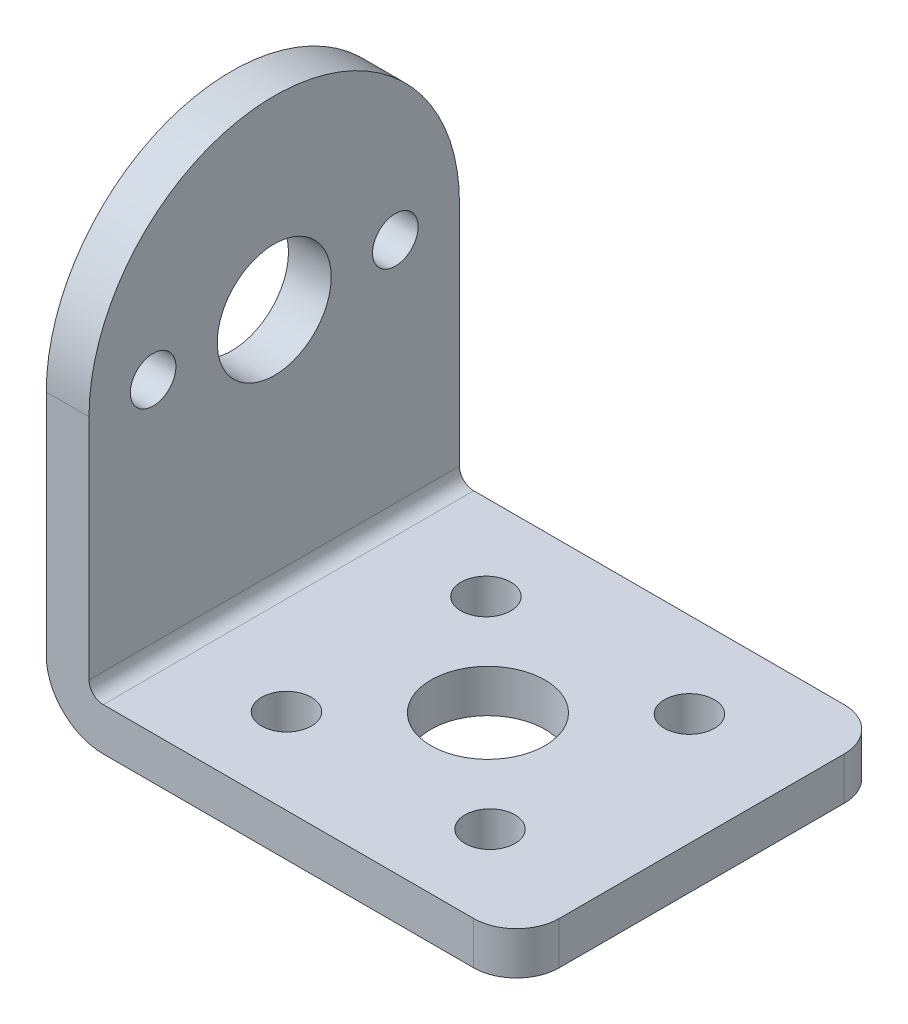
ISO-10303-21;
HEADER;
FILE_DESCRIPTION(('STEP AP214'),'2;1');
FILE_NAME('part.step','',(''),(''),'','','');
FILE_SCHEMA(('AUTOMOTIVE_DESIGN { 1 0 10303 214 1 1 1 1 }'));
ENDSEC;
DATA;
#1=APPLICATION_CONTEXT('core data for automotive mechanical design processes');
#2=APPLICATION_PROTOCOL_DEFINITION('international standard','automotive_design',2000,#1);
#3=PRODUCT_CONTEXT('',#1,'mechanical');
#4=PRODUCT('Part','Part','',(#3));
#5=PRODUCT_RELATED_PRODUCT_CATEGORY('part','',(#4));
#6=PRODUCT_DEFINITION_FORMATION('','',#4);
#7=PRODUCT_DEFINITION_CONTEXT('part definition',#1,'design');
#8=PRODUCT_DEFINITION('design','',#6,#7);
#9=PRODUCT_DEFINITION_SHAPE('','',#8);
#10=(LENGTH_UNIT() NAMED_UNIT(*) SI_UNIT(.MILLI.,.METRE.));
#11=(NAMED_UNIT(*) PLANE_ANGLE_UNIT() SI_UNIT($,.RADIAN.));
#12=(NAMED_UNIT(*) SI_UNIT($,.STERADIAN.) SOLID_ANGLE_UNIT());
#13=UNCERTAINTY_MEASURE_WITH_UNIT(LENGTH_MEASURE(1.E-05),#10,'distance_accuracy_value','');
#14=(GEOMETRIC_REPRESENTATION_CONTEXT(3) GLOBAL_UNCERTAINTY_ASSIGNED_CONTEXT((#13)) GLOBAL_UNIT_ASSIGNED_CONTEXT((#10,
#11,#12)) REPRESENTATION_CONTEXT('',''));
#15=CARTESIAN_POINT('',(0.,0.,0.));
#16=DIRECTION('',(0.,0.,1.));
#17=DIRECTION('',(1.,0.,0.));
#18=AXIS2_PLACEMENT_3D('',#15,#16,#17);
#19=CARTESIAN_POINT('',(0.,4.00000000000003,-13.));
#20=DIRECTION('',(-1.,0.,0.));
#21=DIRECTION('',(0.,0.,1.));
#22=AXIS2_PLACEMENT_3D('',#19,#20,#21);
#23=PLANE('',#22);
#24=CARTESIAN_POINT('',(0.,20.,8.5));
#25=DIRECTION('',(-1.,0.,0.));
#26=DIRECTION('',(0.,0.,1.));
#27=AXIS2_PLACEMENT_3D('',#24,#25,#26);
#28=CIRCLE('',#27,2.1);
#29=CARTESIAN_POINT('',(0.,20.,10.6));
#30=VERTEX_POINT('',#29);
#31=EDGE_CURVE('E165',#30,#30,#28,.F.);
#32=ORIENTED_EDGE('',*,*,#31,.T.);
#33=EDGE_LOOP('',(#32));
#34=FACE_BOUND('',#33,.T.);
#35=CARTESIAN_POINT('',(0.,20.,-8.5));
#36=DIRECTION('',(-1.,0.,0.));
#37=DIRECTION('',(0.,0.,1.));
#38=AXIS2_PLACEMENT_3D('',#35,#36,#37);
#39=CIRCLE('',#38,2.1);
#40=CARTESIAN_POINT('',(0.,20.,-6.4));
#41=VERTEX_POINT('',#40);
#42=EDGE_CURVE('E150',#41,#41,#39,.F.);
#43=ORIENTED_EDGE('',*,*,#42,.T.);
#44=EDGE_LOOP('',(#43));
#45=FACE_BOUND('',#44,.T.);
#46=CARTESIAN_POINT('',(0.,20.,0.));
#47=DIRECTION('',(1.,0.,0.));
#48=DIRECTION('',(0.,0.,-1.));
#49=AXIS2_PLACEMENT_3D('',#46,#47,#48);
#50=CIRCLE('',#49,4.);
#51=CARTESIAN_POINT('',(0.,20.,-4.));
#52=VERTEX_POINT('',#51);
#53=EDGE_CURVE('E231',#52,#52,#50,.T.);
#54=ORIENTED_EDGE('',*,*,#53,.T.);
#55=EDGE_LOOP('',(#54));
#56=FACE_BOUND('',#55,.T.);
#57=CARTESIAN_POINT('',(0.,20.,0.));
#58=DIRECTION('',(-1.,0.,0.));
#59=DIRECTION('',(0.,0.,-1.));
#60=AXIS2_PLACEMENT_3D('',#57,#58,#59);
#61=CIRCLE('',#60,13.);
#62=CARTESIAN_POINT('',(0.,20.,13.));
#63=VERTEX_POINT('',#62);
#64=CARTESIAN_POINT('',(0.,20.,-13.));
#65=VERTEX_POINT('',#64);
#66=EDGE_CURVE('E120',#63,#65,#61,.T.);
#67=ORIENTED_EDGE('',*,*,#66,.T.);
#68=DIRECTION('',(0.,-1.,0.));
#69=VECTOR('',#68,1.);
#70=CARTESIAN_POINT('',(0.,4.00000000000003,-13.));
#71=LINE('',#70,#69);
#72=CARTESIAN_POINT('',(0.,4.00000000000003,-13.));
#73=VERTEX_POINT('',#72);
#74=EDGE_CURVE('E131',#65,#73,#71,.T.);
#75=ORIENTED_EDGE('',*,*,#74,.T.);
#76=DIRECTION('',(0.,0.,1.));
#77=VECTOR('',#76,1.);
#78=CARTESIAN_POINT('',(0.,4.00000000000003,-13.));
#79=LINE('',#78,#77);
#80=CARTESIAN_POINT('',(0.,4.00000000000003,13.));
#81=VERTEX_POINT('',#80);
#82=EDGE_CURVE('E151',#73,#81,#79,.T.);
#83=ORIENTED_EDGE('',*,*,#82,.T.);
#84=DIRECTION('',(0.,-1.,0.));
#85=VECTOR('',#84,1.);
#86=CARTESIAN_POINT('',(0.,4.00000000000003,13.));
#87=LINE('',#86,#85);
#88=EDGE_CURVE('E133',#63,#81,#87,.T.);
#89=ORIENTED_EDGE('',*,*,#88,.F.);
#90=EDGE_LOOP('',(#67,#75,#83,#89));
#91=FACE_BOUND('',#90,.T.);
#92=ADVANCED_FACE('F36',(#34,#45,#56,#91),#23,.T.);
#93=CARTESIAN_POINT('',(3.,4.00000000000003,-13.));
#94=DIRECTION('',(-1.,0.,0.));
#95=DIRECTION('',(0.,0.,1.));
#96=AXIS2_PLACEMENT_3D('',#93,#94,#95);
#97=PLANE('',#96);
#98=CARTESIAN_POINT('',(3.,20.,-8.5));
#99=DIRECTION('',(1.,0.,0.));
#100=DIRECTION('',(0.,0.,1.));
#101=AXIS2_PLACEMENT_3D('',#98,#99,#100);
#102=CIRCLE('',#101,1.6);
#103=CARTESIAN_POINT('',(3.,20.,-6.9));
#104=VERTEX_POINT('',#103);
#105=EDGE_CURVE('E481',#104,#104,#102,.T.);
#106=ORIENTED_EDGE('',*,*,#105,.F.);
#107=EDGE_LOOP('',(#106));
#108=FACE_BOUND('',#107,.T.);
#109=CARTESIAN_POINT('',(3.,20.,8.5));
#110=DIRECTION('',(1.,0.,0.));
#111=DIRECTION('',(0.,0.,-1.));
#112=AXIS2_PLACEMENT_3D('',#109,#110,#111);
#113=CIRCLE('',#112,1.6);
#114=CARTESIAN_POINT('',(3.,20.,6.9));
#115=VERTEX_POINT('',#114);
#116=EDGE_CURVE('E477',#115,#115,#113,.T.);
#117=ORIENTED_EDGE('',*,*,#116,.F.);
#118=EDGE_LOOP('',(#117));
#119=FACE_BOUND('',#118,.T.);
#120=CARTESIAN_POINT('',(3.,20.,0.));
#121=DIRECTION('',(1.,0.,0.));
#122=DIRECTION('',(0.,0.,-1.));
#123=AXIS2_PLACEMENT_3D('',#120,#121,#122);
#124=CIRCLE('',#123,4.);
#125=CARTESIAN_POINT('',(3.,20.,-4.));
#126=VERTEX_POINT('',#125);
#127=EDGE_CURVE('E475',#126,#126,#124,.T.);
#128=ORIENTED_EDGE('',*,*,#127,.F.);
#129=EDGE_LOOP('',(#128));
#130=FACE_BOUND('',#129,.T.);
#131=DIRECTION('',(0.,1.,0.));
#132=VECTOR('',#131,1.);
#133=CARTESIAN_POINT('',(3.,4.00000000000003,-13.));
#134=LINE('',#133,#132);
#135=CARTESIAN_POINT('',(3.,20.,-13.));
#136=VERTEX_POINT('',#135);
#137=CARTESIAN_POINT('',(3.,4.00000000000001,-13.));
#138=VERTEX_POINT('',#137);
#139=EDGE_CURVE('E140',#136,#138,#134,.F.);
#140=ORIENTED_EDGE('',*,*,#139,.F.);
#141=CARTESIAN_POINT('',(3.,20.,0.));
#142=DIRECTION('',(-1.,0.,0.));
#143=DIRECTION('',(0.,0.,-1.));
#144=AXIS2_PLACEMENT_3D('',#141,#142,#143);
#145=CIRCLE('',#144,13.);
#146=CARTESIAN_POINT('',(3.,20.,13.));
#147=VERTEX_POINT('',#146);
#148=EDGE_CURVE('E122',#147,#136,#145,.T.);
#149=ORIENTED_EDGE('',*,*,#148,.F.);
#150=DIRECTION('',(0.,1.,0.));
#151=VECTOR('',#150,1.);
#152=CARTESIAN_POINT('',(3.,4.00000000000003,13.));
#153=LINE('',#152,#151);
#154=CARTESIAN_POINT('',(3.,4.00000000000001,13.));
#155=VERTEX_POINT('',#154);
#156=EDGE_CURVE('E213',#147,#155,#153,.F.);
#157=ORIENTED_EDGE('',*,*,#156,.T.);
#158=DIRECTION('',(0.,0.,1.));
#159=VECTOR('',#158,1.);
#160=CARTESIAN_POINT('',(3.,4.00000000000001,-13.));
#161=LINE('',#160,#159);
#162=EDGE_CURVE('E153',#138,#155,#161,.T.);
#163=ORIENTED_EDGE('',*,*,#162,.F.);
#164=EDGE_LOOP('',(#140,#149,#157,#163));
#165=FACE_BOUND('',#164,.T.);
#166=ADVANCED_FACE('F230',(#108,#119,#130,#165),#97,.F.);
#167=CARTESIAN_POINT('',(4.00000000000003,0.,-13.));
#168=DIRECTION('',(0.,-1.,0.));
#169=DIRECTION('',(0.,0.,-1.));
#170=AXIS2_PLACEMENT_3D('',#167,#168,#169);
#171=PLANE('',#170);
#172=CARTESIAN_POINT('',(10.8585715714571,0.,-7.));
#173=DIRECTION('',(0.,1.,0.));
#174=DIRECTION('',(0.,0.,1.));
#175=AXIS2_PLACEMENT_3D('',#172,#173,#174);
#176=CIRCLE('',#175,1.75);
#177=CARTESIAN_POINT('',(10.8585715714571,0.,-5.25));
#178=VERTEX_POINT('',#177);
#179=EDGE_CURVE('E239',#178,#178,#176,.T.);
#180=ORIENTED_EDGE('',*,*,#179,.T.);
#181=EDGE_LOOP('',(#180));
#182=FACE_BOUND('',#181,.T.);
#183=CARTESIAN_POINT('',(10.8585715714571,0.,7.));
#184=DIRECTION('',(0.,1.,0.));
#185=DIRECTION('',(0.,0.,-1.));
#186=AXIS2_PLACEMENT_3D('',#183,#184,#185);
#187=CIRCLE('',#186,1.75);
#188=CARTESIAN_POINT('',(10.8585715714571,0.,5.25));
#189=VERTEX_POINT('',#188);
#190=EDGE_CURVE('E245',#189,#189,#187,.T.);
#191=ORIENTED_EDGE('',*,*,#190,.T.);
#192=EDGE_LOOP('',(#191));
#193=FACE_BOUND('',#192,.T.);
#194=CARTESIAN_POINT('',(25.1414284285429,0.,7.));
#195=DIRECTION('',(0.,1.,0.));
#196=DIRECTION('',(0.,0.,1.));
#197=AXIS2_PLACEMENT_3D('',#194,#195,#196);
#198=CIRCLE('',#197,1.75);
#199=CARTESIAN_POINT('',(25.1414284285429,0.,8.75));
#200=VERTEX_POINT('',#199);
#201=EDGE_CURVE('E251',#200,#200,#198,.T.);
#202=ORIENTED_EDGE('',*,*,#201,.T.);
#203=EDGE_LOOP('',(#202));
#204=FACE_BOUND('',#203,.T.);
#205=CARTESIAN_POINT('',(25.1414284285429,0.,-7.));
#206=DIRECTION('',(0.,1.,0.));
#207=DIRECTION('',(0.,0.,-1.));
#208=AXIS2_PLACEMENT_3D('',#205,#206,#207);
#209=CIRCLE('',#208,1.75);
#210=CARTESIAN_POINT('',(25.1414284285429,0.,-8.75));
#211=VERTEX_POINT('',#210);
#212=EDGE_CURVE('E236',#211,#211,#209,.T.);
#213=ORIENTED_EDGE('',*,*,#212,.T.);
#214=EDGE_LOOP('',(#213));
#215=FACE_BOUND('',#214,.T.);
#216=CARTESIAN_POINT('',(18.,0.,0.));
#217=DIRECTION('',(0.,1.,0.));
#218=DIRECTION('',(0.,0.,1.));
#219=AXIS2_PLACEMENT_3D('',#216,#217,#218);
#220=CIRCLE('',#219,4.);
#221=CARTESIAN_POINT('',(18.,0.,4.));
#222=VERTEX_POINT('',#221);
#223=EDGE_CURVE('E202',#222,#222,#220,.T.);
#224=ORIENTED_EDGE('',*,*,#223,.T.);
#225=EDGE_LOOP('',(#224));
#226=FACE_BOUND('',#225,.T.);
#227=DIRECTION('',(0.,0.,1.));
#228=VECTOR('',#227,1.);
#229=CARTESIAN_POINT('',(33.,0.,-13.));
#230=LINE('',#229,#228);
#231=CARTESIAN_POINT('',(33.,0.,-10.));
#232=VERTEX_POINT('',#231);
#233=CARTESIAN_POINT('',(33.,0.,9.99999999999999));
#234=VERTEX_POINT('',#233);
#235=EDGE_CURVE('E142',#232,#234,#230,.T.);
#236=ORIENTED_EDGE('',*,*,#235,.T.);
#237=CARTESIAN_POINT('',(30.,0.,10.));
#238=DIRECTION('',(0.,-1.,0.));
#239=DIRECTION('',(0.,0.,-1.));
#240=AXIS2_PLACEMENT_3D('',#237,#238,#239);
#241=CIRCLE('',#240,3.);
#242=CARTESIAN_POINT('',(30.,0.,13.));
#243=VERTEX_POINT('',#242);
#244=EDGE_CURVE('E181',#234,#243,#241,.T.);
#245=ORIENTED_EDGE('',*,*,#244,.T.);
#246=DIRECTION('',(1.,0.,0.));
#247=VECTOR('',#246,1.);
#248=CARTESIAN_POINT('',(4.00000000000003,0.,13.));
#249=LINE('',#248,#247);
#250=CARTESIAN_POINT('',(4.00000000000003,0.,13.));
#251=VERTEX_POINT('',#250);
#252=EDGE_CURVE('E197',#251,#243,#249,.T.);
#253=ORIENTED_EDGE('',*,*,#252,.F.);
#254=DIRECTION('',(0.,0.,1.));
#255=VECTOR('',#254,1.);
#256=CARTESIAN_POINT('',(4.00000000000003,0.,-13.));
#257=LINE('',#256,#255);
#258=CARTESIAN_POINT('',(4.00000000000003,0.,-13.));
#259=VERTEX_POINT('',#258);
#260=EDGE_CURVE('E148',#259,#251,#257,.T.);
#261=ORIENTED_EDGE('',*,*,#260,.F.);
#262=DIRECTION('',(1.,0.,0.));
#263=VECTOR('',#262,1.);
#264=CARTESIAN_POINT('',(4.00000000000003,0.,-13.));
#265=LINE('',#264,#263);
#266=CARTESIAN_POINT('',(30.,0.,-13.));
#267=VERTEX_POINT('',#266);
#268=EDGE_CURVE('E217',#259,#267,#265,.T.);
#269=ORIENTED_EDGE('',*,*,#268,.T.);
#270=CARTESIAN_POINT('',(30.,0.,-10.));
#271=DIRECTION('',(0.,-1.,0.));
#272=DIRECTION('',(0.,0.,-1.));
#273=AXIS2_PLACEMENT_3D('',#270,#271,#272);
#274=CIRCLE('',#273,3.);
#275=EDGE_CURVE('E179',#267,#232,#274,.T.);
#276=ORIENTED_EDGE('',*,*,#275,.T.);
#277=EDGE_LOOP('',(#236,#245,#253,#261,#269,#276));
#278=FACE_BOUND('',#277,.T.);
#279=ADVANCED_FACE('F196',(#182,#193,#204,#215,#226,#278),#171,.T.);
#280=CARTESIAN_POINT('',(4.,4.,-13.));
#281=DIRECTION('',(0.,0.,1.));
#282=DIRECTION('',(1.,0.,0.));
#283=AXIS2_PLACEMENT_3D('',#280,#281,#282);
#284=CYLINDRICAL_SURFACE('',#283,4.);
#285=ORIENTED_EDGE('',*,*,#260,.T.);
#286=CARTESIAN_POINT('',(4.,4.,13.));
#287=DIRECTION('',(0.,0.,1.));
#288=DIRECTION('',(1.,0.,0.));
#289=AXIS2_PLACEMENT_3D('',#286,#287,#288);
#290=CIRCLE('',#289,4.);
#291=EDGE_CURVE('E201',#81,#251,#290,.T.);
#292=ORIENTED_EDGE('',*,*,#291,.F.);
#293=ORIENTED_EDGE('',*,*,#82,.F.);
#294=CARTESIAN_POINT('',(4.,4.,-13.));
#295=DIRECTION('',(0.,0.,1.));
#296=DIRECTION('',(1.,0.,0.));
#297=AXIS2_PLACEMENT_3D('',#294,#295,#296);
#298=CIRCLE('',#297,4.);
#299=EDGE_CURVE('E139',#73,#259,#298,.T.);
#300=ORIENTED_EDGE('',*,*,#299,.T.);
#301=EDGE_LOOP('',(#285,#292,#293,#300));
#302=FACE_BOUND('',#301,.T.);
#303=ADVANCED_FACE('F295',(#302),#284,.T.);
#304=CARTESIAN_POINT('',(4.,4.,-13.));
#305=DIRECTION('',(0.,0.,1.));
#306=DIRECTION('',(1.,0.,0.));
#307=AXIS2_PLACEMENT_3D('',#304,#305,#306);
#308=CYLINDRICAL_SURFACE('',#307,1.);
#309=ORIENTED_EDGE('',*,*,#162,.T.);
#310=CARTESIAN_POINT('',(4.,4.,13.));
#311=DIRECTION('',(0.,0.,1.));
#312=DIRECTION('',(1.,0.,0.));
#313=AXIS2_PLACEMENT_3D('',#310,#311,#312);
#314=CIRCLE('',#313,1.);
#315=CARTESIAN_POINT('',(4.00000000000003,3.,13.));
#316=VERTEX_POINT('',#315);
#317=EDGE_CURVE('E204',#155,#316,#314,.T.);
#318=ORIENTED_EDGE('',*,*,#317,.T.);
#319=DIRECTION('',(0.,0.,1.));
#320=VECTOR('',#319,1.);
#321=CARTESIAN_POINT('',(4.00000000000003,3.,-13.));
#322=LINE('',#321,#320);
#323=CARTESIAN_POINT('',(4.00000000000003,3.,-13.));
#324=VERTEX_POINT('',#323);
#325=EDGE_CURVE('E156',#324,#316,#322,.T.);
#326=ORIENTED_EDGE('',*,*,#325,.F.);
#327=CARTESIAN_POINT('',(4.,4.,-13.));
#328=DIRECTION('',(0.,0.,1.));
#329=DIRECTION('',(1.,0.,0.));
#330=AXIS2_PLACEMENT_3D('',#327,#328,#329);
#331=CIRCLE('',#330,1.);
#332=EDGE_CURVE('E144',#138,#324,#331,.T.);
#333=ORIENTED_EDGE('',*,*,#332,.F.);
#334=EDGE_LOOP('',(#309,#318,#326,#333));
#335=FACE_BOUND('',#334,.T.);
#336=ADVANCED_FACE('F226',(#335),#308,.F.);
#337=CARTESIAN_POINT('',(4.00000000000003,3.,-13.));
#338=DIRECTION('',(0.,-1.,0.));
#339=DIRECTION('',(0.,0.,-1.));
#340=AXIS2_PLACEMENT_3D('',#337,#338,#339);
#341=PLANE('',#340);
#342=CARTESIAN_POINT('',(10.8585715714571,3.,-7.));
#343=DIRECTION('',(0.,1.,0.));
#344=DIRECTION('',(0.,0.,1.));
#345=AXIS2_PLACEMENT_3D('',#342,#343,#344);
#346=CIRCLE('',#345,1.75);
#347=CARTESIAN_POINT('',(10.8585715714571,3.,-5.25));
#348=VERTEX_POINT('',#347);
#349=EDGE_CURVE('E242',#348,#348,#346,.T.);
#350=ORIENTED_EDGE('',*,*,#349,.F.);
#351=EDGE_LOOP('',(#350));
#352=FACE_BOUND('',#351,.T.);
#353=CARTESIAN_POINT('',(10.8585715714571,3.,7.));
#354=DIRECTION('',(0.,1.,0.));
#355=DIRECTION('',(0.,0.,-1.));
#356=AXIS2_PLACEMENT_3D('',#353,#354,#355);
#357=CIRCLE('',#356,1.75);
#358=CARTESIAN_POINT('',(10.8585715714571,3.,5.25));
#359=VERTEX_POINT('',#358);
#360=EDGE_CURVE('E248',#359,#359,#357,.T.);
#361=ORIENTED_EDGE('',*,*,#360,.F.);
#362=EDGE_LOOP('',(#361));
#363=FACE_BOUND('',#362,.T.);
#364=CARTESIAN_POINT('',(25.1414284285429,3.,7.));
#365=DIRECTION('',(0.,1.,0.));
#366=DIRECTION('',(0.,0.,1.));
#367=AXIS2_PLACEMENT_3D('',#364,#365,#366);
#368=CIRCLE('',#367,1.75);
#369=CARTESIAN_POINT('',(25.1414284285429,3.,8.75));
#370=VERTEX_POINT('',#369);
#371=EDGE_CURVE('E254',#370,#370,#368,.T.);
#372=ORIENTED_EDGE('',*,*,#371,.F.);
#373=EDGE_LOOP('',(#372));
#374=FACE_BOUND('',#373,.T.);
#375=CARTESIAN_POINT('',(25.1414284285429,3.,-7.));
#376=DIRECTION('',(0.,1.,0.));
#377=DIRECTION('',(0.,0.,-1.));
#378=AXIS2_PLACEMENT_3D('',#375,#376,#377);
#379=CIRCLE('',#378,1.75);
#380=CARTESIAN_POINT('',(25.1414284285429,3.,-8.75));
#381=VERTEX_POINT('',#380);
#382=EDGE_CURVE('E233',#381,#381,#379,.T.);
#383=ORIENTED_EDGE('',*,*,#382,.F.);
#384=EDGE_LOOP('',(#383));
#385=FACE_BOUND('',#384,.T.);
#386=CARTESIAN_POINT('',(18.,3.,0.));
#387=DIRECTION('',(0.,1.,0.));
#388=DIRECTION('',(0.,0.,1.));
#389=AXIS2_PLACEMENT_3D('',#386,#387,#388);
#390=CIRCLE('',#389,4.);
#391=CARTESIAN_POINT('',(18.,3.,4.));
#392=VERTEX_POINT('',#391);
#393=EDGE_CURVE('E207',#392,#392,#390,.T.);
#394=ORIENTED_EDGE('',*,*,#393,.F.);
#395=EDGE_LOOP('',(#394));
#396=FACE_BOUND('',#395,.T.);
#397=DIRECTION('',(1.,0.,0.));
#398=VECTOR('',#397,1.);
#399=CARTESIAN_POINT('',(4.00000000000003,3.,13.));
#400=LINE('',#399,#398);
#401=CARTESIAN_POINT('',(30.,3.,13.));
#402=VERTEX_POINT('',#401);
#403=EDGE_CURVE('E186',#316,#402,#400,.T.);
#404=ORIENTED_EDGE('',*,*,#403,.T.);
#405=CARTESIAN_POINT('',(30.,3.,10.));
#406=DIRECTION('',(0.,-1.,0.));
#407=DIRECTION('',(0.,0.,-1.));
#408=AXIS2_PLACEMENT_3D('',#405,#406,#407);
#409=CIRCLE('',#408,3.);
#410=CARTESIAN_POINT('',(33.,3.,9.99999999999999));
#411=VERTEX_POINT('',#410);
#412=EDGE_CURVE('E44',#402,#411,#409,.F.);
#413=ORIENTED_EDGE('',*,*,#412,.T.);
#414=DIRECTION('',(0.,0.,1.));
#415=VECTOR('',#414,1.);
#416=CARTESIAN_POINT('',(33.,3.,-13.));
#417=LINE('',#416,#415);
#418=CARTESIAN_POINT('',(33.,3.,-10.));
#419=VERTEX_POINT('',#418);
#420=EDGE_CURVE('E158',#419,#411,#417,.T.);
#421=ORIENTED_EDGE('',*,*,#420,.F.);
#422=CARTESIAN_POINT('',(30.,3.,-10.));
#423=DIRECTION('',(0.,-1.,0.));
#424=DIRECTION('',(0.,0.,-1.));
#425=AXIS2_PLACEMENT_3D('',#422,#423,#424);
#426=CIRCLE('',#425,3.);
#427=CARTESIAN_POINT('',(30.,3.,-13.));
#428=VERTEX_POINT('',#427);
#429=EDGE_CURVE('E51',#419,#428,#426,.F.);
#430=ORIENTED_EDGE('',*,*,#429,.T.);
#431=DIRECTION('',(1.,0.,0.));
#432=VECTOR('',#431,1.);
#433=CARTESIAN_POINT('',(4.00000000000003,3.,-13.));
#434=LINE('',#433,#432);
#435=EDGE_CURVE('E220',#324,#428,#434,.T.);
#436=ORIENTED_EDGE('',*,*,#435,.F.);
#437=ORIENTED_EDGE('',*,*,#325,.T.);
#438=EDGE_LOOP('',(#404,#413,#421,#430,#436,#437));
#439=FACE_BOUND('',#438,.T.);
#440=ADVANCED_FACE('F185',(#352,#363,#374,#385,#396,#439),#341,.F.);
#441=CARTESIAN_POINT('',(33.,3.,-13.));
#442=DIRECTION('',(-1.,0.,0.));
#443=DIRECTION('',(0.,0.,1.));
#444=AXIS2_PLACEMENT_3D('',#441,#442,#443);
#445=PLANE('',#444);
#446=ORIENTED_EDGE('',*,*,#420,.T.);
#447=DIRECTION('',(0.,-1.,0.));
#448=VECTOR('',#447,1.);
#449=CARTESIAN_POINT('',(33.,0.,10.));
#450=LINE('',#449,#448);
#451=EDGE_CURVE('E176',#411,#234,#450,.T.);
#452=ORIENTED_EDGE('',*,*,#451,.T.);
#453=ORIENTED_EDGE('',*,*,#235,.F.);
#454=DIRECTION('',(0.,-1.,0.));
#455=VECTOR('',#454,1.);
#456=CARTESIAN_POINT('',(33.,3.,-10.));
#457=LINE('',#456,#455);
#458=EDGE_CURVE('E174',#232,#419,#457,.F.);
#459=ORIENTED_EDGE('',*,*,#458,.T.);
#460=EDGE_LOOP('',(#446,#452,#453,#459));
#461=FACE_BOUND('',#460,.T.);
#462=ADVANCED_FACE('F190',(#461),#445,.F.);
#463=CARTESIAN_POINT('',(4.,4.,-13.));
#464=DIRECTION('',(0.,0.,1.));
#465=DIRECTION('',(1.,0.,0.));
#466=AXIS2_PLACEMENT_3D('',#463,#464,#465);
#467=PLANE('',#466);
#468=ORIENTED_EDGE('',*,*,#435,.T.);
#469=DIRECTION('',(0.,-1.,0.));
#470=VECTOR('',#469,1.);
#471=CARTESIAN_POINT('',(30.,4.,-13.));
#472=LINE('',#471,#470);
#473=EDGE_CURVE('E11',#428,#267,#472,.T.);
#474=ORIENTED_EDGE('',*,*,#473,.T.);
#475=ORIENTED_EDGE('',*,*,#268,.F.);
#476=ORIENTED_EDGE('',*,*,#299,.F.);
#477=ORIENTED_EDGE('',*,*,#74,.F.);
#478=DIRECTION('',(1.,0.,0.));
#479=VECTOR('',#478,1.);
#480=CARTESIAN_POINT('',(0.,20.,-13.));
#481=LINE('',#480,#479);
#482=EDGE_CURVE('E116',#65,#136,#481,.T.);
#483=ORIENTED_EDGE('',*,*,#482,.T.);
#484=ORIENTED_EDGE('',*,*,#139,.T.);
#485=ORIENTED_EDGE('',*,*,#332,.T.);
#486=EDGE_LOOP('',(#468,#474,#475,#476,#477,#483,#484,#485));
#487=FACE_BOUND('',#486,.T.);
#488=ADVANCED_FACE('F136',(#487),#467,.F.);
#489=CARTESIAN_POINT('',(4.,4.,13.));
#490=DIRECTION('',(0.,0.,1.));
#491=DIRECTION('',(1.,0.,0.));
#492=AXIS2_PLACEMENT_3D('',#489,#490,#491);
#493=PLANE('',#492);
#494=ORIENTED_EDGE('',*,*,#252,.T.);
#495=DIRECTION('',(0.,-1.,0.));
#496=VECTOR('',#495,1.);
#497=CARTESIAN_POINT('',(30.,3.,13.));
#498=LINE('',#497,#496);
#499=EDGE_CURVE('E59',#243,#402,#498,.F.);
#500=ORIENTED_EDGE('',*,*,#499,.T.);
#501=ORIENTED_EDGE('',*,*,#403,.F.);
#502=ORIENTED_EDGE('',*,*,#317,.F.);
#503=ORIENTED_EDGE('',*,*,#156,.F.);
#504=DIRECTION('',(1.,0.,0.));
#505=VECTOR('',#504,1.);
#506=CARTESIAN_POINT('',(0.,20.,13.));
#507=LINE('',#506,#505);
#508=EDGE_CURVE('E126',#63,#147,#507,.T.);
#509=ORIENTED_EDGE('',*,*,#508,.F.);
#510=ORIENTED_EDGE('',*,*,#88,.T.);
#511=ORIENTED_EDGE('',*,*,#291,.T.);
#512=EDGE_LOOP('',(#494,#500,#501,#502,#503,#509,#510,#511));
#513=FACE_BOUND('',#512,.T.);
#514=ADVANCED_FACE('F199',(#513),#493,.T.);
#515=CARTESIAN_POINT('',(18.,0.,0.));
#516=DIRECTION('',(0.,1.,0.));
#517=DIRECTION('',(0.,0.,1.));
#518=AXIS2_PLACEMENT_3D('',#515,#516,#517);
#519=CYLINDRICAL_SURFACE('',#518,4.);
#520=ORIENTED_EDGE('',*,*,#223,.F.);
#521=EDGE_LOOP('',(#520));
#522=FACE_BOUND('',#521,.T.);
#523=ORIENTED_EDGE('',*,*,#393,.T.);
#524=EDGE_LOOP('',(#523));
#525=FACE_BOUND('',#524,.T.);
#526=ADVANCED_FACE('F266',(#522,#525),#519,.F.);
#527=CARTESIAN_POINT('',(25.1414284285429,0.,-7.));
#528=DIRECTION('',(0.,1.,0.));
#529=DIRECTION('',(0.,0.,1.));
#530=AXIS2_PLACEMENT_3D('',#527,#528,#529);
#531=CYLINDRICAL_SURFACE('',#530,1.75);
#532=ORIENTED_EDGE('',*,*,#212,.F.);
#533=EDGE_LOOP('',(#532));
#534=FACE_BOUND('',#533,.T.);
#535=ORIENTED_EDGE('',*,*,#382,.T.);
#536=EDGE_LOOP('',(#535));
#537=FACE_BOUND('',#536,.T.);
#538=ADVANCED_FACE('F262',(#534,#537),#531,.F.);
#539=CARTESIAN_POINT('',(25.1414284285429,0.,7.));
#540=DIRECTION('',(0.,1.,0.));
#541=DIRECTION('',(0.,0.,1.));
#542=AXIS2_PLACEMENT_3D('',#539,#540,#541);
#543=CYLINDRICAL_SURFACE('',#542,1.75);
#544=ORIENTED_EDGE('',*,*,#201,.F.);
#545=EDGE_LOOP('',(#544));
#546=FACE_BOUND('',#545,.T.);
#547=ORIENTED_EDGE('',*,*,#371,.T.);
#548=EDGE_LOOP('',(#547));
#549=FACE_BOUND('',#548,.T.);
#550=ADVANCED_FACE('F265',(#546,#549),#543,.F.);
#551=CARTESIAN_POINT('',(10.8585715714571,0.,7.));
#552=DIRECTION('',(0.,1.,0.));
#553=DIRECTION('',(0.,0.,1.));
#554=AXIS2_PLACEMENT_3D('',#551,#552,#553);
#555=CYLINDRICAL_SURFACE('',#554,1.75);
#556=ORIENTED_EDGE('',*,*,#190,.F.);
#557=EDGE_LOOP('',(#556));
#558=FACE_BOUND('',#557,.T.);
#559=ORIENTED_EDGE('',*,*,#360,.T.);
#560=EDGE_LOOP('',(#559));
#561=FACE_BOUND('',#560,.T.);
#562=ADVANCED_FACE('F419',(#558,#561),#555,.F.);
#563=CARTESIAN_POINT('',(10.8585715714571,0.,-7.));
#564=DIRECTION('',(0.,1.,0.));
#565=DIRECTION('',(0.,0.,1.));
#566=AXIS2_PLACEMENT_3D('',#563,#564,#565);
#567=CYLINDRICAL_SURFACE('',#566,1.75);
#568=ORIENTED_EDGE('',*,*,#179,.F.);
#569=EDGE_LOOP('',(#568));
#570=FACE_BOUND('',#569,.T.);
#571=ORIENTED_EDGE('',*,*,#349,.T.);
#572=EDGE_LOOP('',(#571));
#573=FACE_BOUND('',#572,.T.);
#574=ADVANCED_FACE('F402',(#570,#573),#567,.F.);
#575=CARTESIAN_POINT('',(0.,20.,0.));
#576=DIRECTION('',(1.,0.,0.));
#577=DIRECTION('',(0.,0.,-1.));
#578=AXIS2_PLACEMENT_3D('',#575,#576,#577);
#579=CYLINDRICAL_SURFACE('',#578,13.);
#580=ORIENTED_EDGE('',*,*,#148,.T.);
#581=ORIENTED_EDGE('',*,*,#482,.F.);
#582=ORIENTED_EDGE('',*,*,#66,.F.);
#583=ORIENTED_EDGE('',*,*,#508,.T.);
#584=EDGE_LOOP('',(#580,#581,#582,#583));
#585=FACE_BOUND('',#584,.T.);
#586=ADVANCED_FACE('F118',(#585),#579,.T.);
#587=CARTESIAN_POINT('',(0.,20.,0.));
#588=DIRECTION('',(1.,0.,0.));
#589=DIRECTION('',(0.,0.,-1.));
#590=AXIS2_PLACEMENT_3D('',#587,#588,#589);
#591=CYLINDRICAL_SURFACE('',#590,4.);
#592=ORIENTED_EDGE('',*,*,#53,.F.);
#593=EDGE_LOOP('',(#592));
#594=FACE_BOUND('',#593,.T.);
#595=ORIENTED_EDGE('',*,*,#127,.T.);
#596=EDGE_LOOP('',(#595));
#597=FACE_BOUND('',#596,.T.);
#598=ADVANCED_FACE('F385',(#594,#597),#591,.F.);
#599=CARTESIAN_POINT('',(0.,20.,8.5));
#600=DIRECTION('',(1.,0.,0.));
#601=DIRECTION('',(0.,0.,-1.));
#602=AXIS2_PLACEMENT_3D('',#599,#600,#601);
#603=CYLINDRICAL_SURFACE('',#602,1.6);
#604=CARTESIAN_POINT('',(0.500000000000006,20.,8.5));
#605=DIRECTION('',(-1.,0.,0.));
#606=DIRECTION('',(0.,0.,1.));
#607=AXIS2_PLACEMENT_3D('',#604,#605,#606);
#608=CIRCLE('',#607,1.6);
#609=CARTESIAN_POINT('',(0.500000000000006,20.,10.1));
#610=VERTEX_POINT('',#609);
#611=EDGE_CURVE('E168',#610,#610,#608,.T.);
#612=ORIENTED_EDGE('',*,*,#611,.T.);
#613=EDGE_LOOP('',(#612));
#614=FACE_BOUND('',#613,.T.);
#615=ORIENTED_EDGE('',*,*,#116,.T.);
#616=EDGE_LOOP('',(#615));
#617=FACE_BOUND('',#616,.T.);
#618=ADVANCED_FACE('F376',(#614,#617),#603,.F.);
#619=CARTESIAN_POINT('',(0.,20.,-8.5));
#620=DIRECTION('',(1.,0.,0.));
#621=DIRECTION('',(0.,0.,-1.));
#622=AXIS2_PLACEMENT_3D('',#619,#620,#621);
#623=CYLINDRICAL_SURFACE('',#622,1.6);
#624=CARTESIAN_POINT('',(0.500000000000006,20.,-8.5));
#625=DIRECTION('',(-1.,0.,0.));
#626=DIRECTION('',(0.,0.,1.));
#627=AXIS2_PLACEMENT_3D('',#624,#625,#626);
#628=CIRCLE('',#627,1.6);
#629=CARTESIAN_POINT('',(0.500000000000006,20.,-6.9));
#630=VERTEX_POINT('',#629);
#631=EDGE_CURVE('E171',#630,#630,#628,.T.);
#632=ORIENTED_EDGE('',*,*,#631,.T.);
#633=EDGE_LOOP('',(#632));
#634=FACE_BOUND('',#633,.T.);
#635=ORIENTED_EDGE('',*,*,#105,.T.);
#636=EDGE_LOOP('',(#635));
#637=FACE_BOUND('',#636,.T.);
#638=ADVANCED_FACE('F309',(#634,#637),#623,.F.);
#639=CARTESIAN_POINT('',(0.,20.,8.5));
#640=DIRECTION('',(-1.,0.,0.));
#641=DIRECTION('',(0.,0.,1.));
#642=AXIS2_PLACEMENT_3D('',#639,#640,#641);
#643=CONICAL_SURFACE('',#642,2.1,0.785398163397447);
#644=ORIENTED_EDGE('',*,*,#611,.F.);
#645=EDGE_LOOP('',(#644));
#646=FACE_BOUND('',#645,.T.);
#647=ORIENTED_EDGE('',*,*,#31,.F.);
#648=EDGE_LOOP('',(#647));
#649=FACE_BOUND('',#648,.T.);
#650=ADVANCED_FACE('F305',(#646,#649),#643,.F.);
#651=CARTESIAN_POINT('',(0.,20.,-8.5));
#652=DIRECTION('',(-1.,0.,0.));
#653=DIRECTION('',(0.,0.,1.));
#654=AXIS2_PLACEMENT_3D('',#651,#652,#653);
#655=CONICAL_SURFACE('',#654,2.1,0.785398163397447);
#656=ORIENTED_EDGE('',*,*,#631,.F.);
#657=EDGE_LOOP('',(#656));
#658=FACE_BOUND('',#657,.T.);
#659=ORIENTED_EDGE('',*,*,#42,.F.);
#660=EDGE_LOOP('',(#659));
#661=FACE_BOUND('',#660,.T.);
#662=ADVANCED_FACE('F308',(#658,#661),#655,.F.);
#663=CARTESIAN_POINT('',(30.,3.,10.));
#664=DIRECTION('',(0.,1.,0.));
#665=DIRECTION('',(0.,0.,1.));
#666=AXIS2_PLACEMENT_3D('',#663,#664,#665);
#667=CYLINDRICAL_SURFACE('',#666,3.);
#668=ORIENTED_EDGE('',*,*,#412,.F.);
#669=ORIENTED_EDGE('',*,*,#499,.F.);
#670=ORIENTED_EDGE('',*,*,#244,.F.);
#671=ORIENTED_EDGE('',*,*,#451,.F.);
#672=EDGE_LOOP('',(#668,#669,#670,#671));
#673=FACE_BOUND('',#672,.T.);
#674=ADVANCED_FACE('F193',(#673),#667,.T.);
#675=CARTESIAN_POINT('',(30.,4.,-10.));
#676=DIRECTION('',(0.,-1.,0.));
#677=DIRECTION('',(0.,0.,-1.));
#678=AXIS2_PLACEMENT_3D('',#675,#676,#677);
#679=CYLINDRICAL_SURFACE('',#678,3.);
#680=ORIENTED_EDGE('',*,*,#429,.F.);
#681=ORIENTED_EDGE('',*,*,#458,.F.);
#682=ORIENTED_EDGE('',*,*,#275,.F.);
#683=ORIENTED_EDGE('',*,*,#473,.F.);
#684=EDGE_LOOP('',(#680,#681,#682,#683));
#685=FACE_BOUND('',#684,.T.);
#686=ADVANCED_FACE('F38',(#685),#679,.T.);
#687=CLOSED_SHELL('',(#92,#166,#279,#303,#336,#440,#462,#488,#514,#526,#538,#550,#562,#574,#586,
#598,#618,#638,#650,#662,#674,#686));
#688=MANIFOLD_SOLID_BREP('B2',#687);
#689=ADVANCED_BREP_SHAPE_REPRESENTATION('',(#18,#688),#14);
#690=SHAPE_DEFINITION_REPRESENTATION(#9,#689);
ENDSEC;
END-ISO-10303-21;
